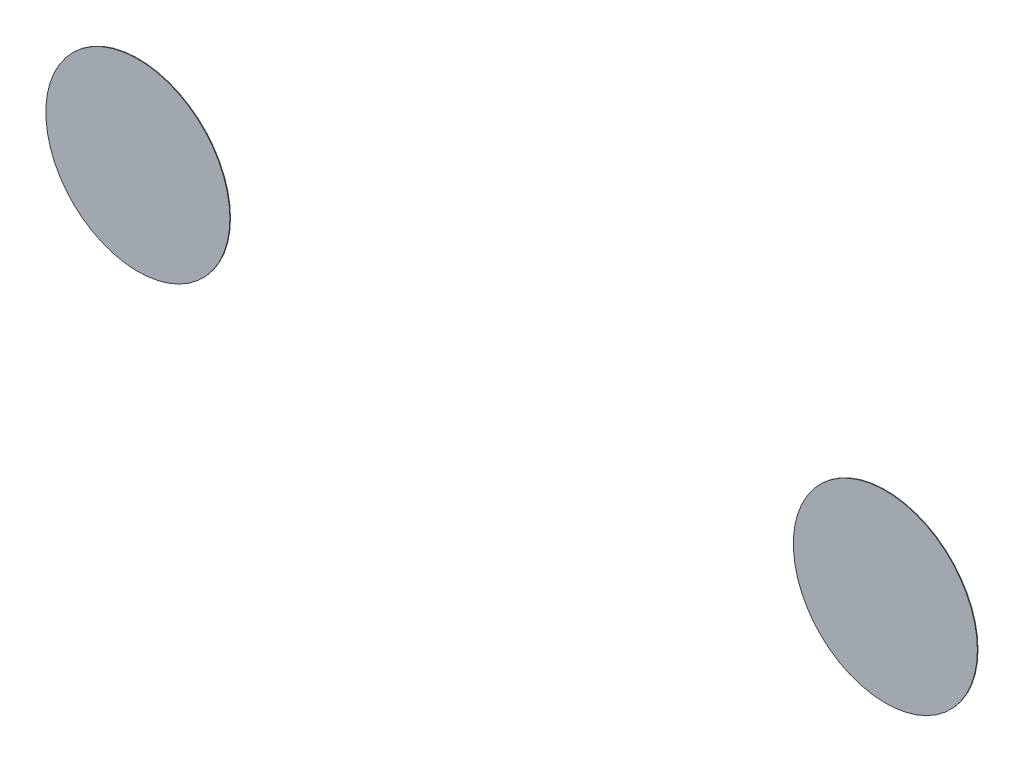
ISO-10303-21;
HEADER;
FILE_DESCRIPTION(('STEP AP214'),'2;1');
FILE_NAME('part.step','',(''),(''),'','','');
FILE_SCHEMA(('AUTOMOTIVE_DESIGN { 1 0 10303 214 1 1 1 1 }'));
ENDSEC;
DATA;
#1=APPLICATION_CONTEXT('core data for automotive mechanical design processes');
#2=APPLICATION_PROTOCOL_DEFINITION('international standard','automotive_design',2000,#1);
#3=PRODUCT_CONTEXT('',#1,'mechanical');
#4=PRODUCT('Part','Part','',(#3));
#5=PRODUCT_RELATED_PRODUCT_CATEGORY('part','',(#4));
#6=PRODUCT_DEFINITION_FORMATION('','',#4);
#7=PRODUCT_DEFINITION_CONTEXT('part definition',#1,'design');
#8=PRODUCT_DEFINITION('design','',#6,#7);
#9=PRODUCT_DEFINITION_SHAPE('','',#8);
#10=(LENGTH_UNIT() NAMED_UNIT(*) SI_UNIT(.MILLI.,.METRE.));
#11=(NAMED_UNIT(*) PLANE_ANGLE_UNIT() SI_UNIT($,.RADIAN.));
#12=(NAMED_UNIT(*) SI_UNIT($,.STERADIAN.) SOLID_ANGLE_UNIT());
#13=UNCERTAINTY_MEASURE_WITH_UNIT(LENGTH_MEASURE(1.E-05),#10,'distance_accuracy_value','');
#14=(GEOMETRIC_REPRESENTATION_CONTEXT(3) GLOBAL_UNCERTAINTY_ASSIGNED_CONTEXT((#13)) GLOBAL_UNIT_ASSIGNED_CONTEXT((#10,
#11,#12)) REPRESENTATION_CONTEXT('',''));
#15=CARTESIAN_POINT('',(0.,0.,0.));
#16=DIRECTION('',(0.,0.,1.));
#17=DIRECTION('',(1.,0.,0.));
#18=AXIS2_PLACEMENT_3D('',#15,#16,#17);
#19=CARTESIAN_POINT('',(-3.78618481556425,-7.17051145702336,0.001));
#20=DIRECTION('',(0.,0.,1.));
#21=DIRECTION('',(1.,0.,0.));
#22=AXIS2_PLACEMENT_3D('',#19,#20,#21);
#23=PLANE('',#22);
#24=CARTESIAN_POINT('',(-3.78618481556425,-7.17051145702336,0.001));
#25=DIRECTION('',(0.,0.,1.));
#26=DIRECTION('',(1.,0.,0.));
#27=AXIS2_PLACEMENT_3D('',#24,#25,#26);
#28=CIRCLE('',#27,0.319576228335678);
#29=CARTESIAN_POINT('',(-3.46660858722857,-7.17051145702336,0.001));
#30=VERTEX_POINT('',#29);
#31=EDGE_CURVE('P0_E22',#30,#30,#28,.F.);
#32=ORIENTED_EDGE('',*,*,#31,.F.);
#33=EDGE_LOOP('',(#32));
#34=FACE_BOUND('',#33,.T.);
#35=ADVANCED_FACE('P0_F15',(#34),#23,.T.);
#36=CARTESIAN_POINT('',(-3.78618481556425,-7.17051145702336,0.));
#37=DIRECTION('',(0.,0.,1.));
#38=DIRECTION('',(1.,0.,0.));
#39=AXIS2_PLACEMENT_3D('',#36,#37,#38);
#40=CYLINDRICAL_SURFACE('',#39,0.319576228335678);
#41=CARTESIAN_POINT('',(-3.78618481556425,-7.17051145702336,-0.001));
#42=DIRECTION('',(0.,0.,1.));
#43=DIRECTION('',(1.,0.,0.));
#44=AXIS2_PLACEMENT_3D('',#41,#42,#43);
#45=CIRCLE('',#44,0.319576228335678);
#46=CARTESIAN_POINT('',(-3.46660858722857,-7.17051145702336,-0.001));
#47=VERTEX_POINT('',#46);
#48=EDGE_CURVE('P0_E10',#47,#47,#45,.T.);
#49=ORIENTED_EDGE('',*,*,#48,.T.);
#50=EDGE_LOOP('',(#49));
#51=FACE_BOUND('',#50,.T.);
#52=ORIENTED_EDGE('',*,*,#31,.T.);
#53=EDGE_LOOP('',(#52));
#54=FACE_BOUND('',#53,.T.);
#55=ADVANCED_FACE('P0_F31',(#51,#54),#40,.T.);
#56=CARTESIAN_POINT('',(-3.78618481556425,-7.17051145702336,-0.001));
#57=DIRECTION('',(0.,0.,1.));
#58=DIRECTION('',(1.,0.,0.));
#59=AXIS2_PLACEMENT_3D('',#56,#57,#58);
#60=PLANE('',#59);
#61=ORIENTED_EDGE('',*,*,#48,.F.);
#62=EDGE_LOOP('',(#61));
#63=FACE_BOUND('',#62,.T.);
#64=ADVANCED_FACE('P0_F38',(#63),#60,.F.);
#65=CLOSED_SHELL('',(#35,#55,#64));
#66=MANIFOLD_SOLID_BREP('P0_B1',#65);
#67=CARTESIAN_POINT('',(-6.38152474236088,-7.17051145702336,0.001));
#68=DIRECTION('',(0.,0.,1.));
#69=DIRECTION('',(1.,0.,0.));
#70=AXIS2_PLACEMENT_3D('',#67,#68,#69);
#71=PLANE('',#70);
#72=CARTESIAN_POINT('',(-6.38152474236088,-7.17051145702336,0.001));
#73=DIRECTION('',(0.,0.,1.));
#74=DIRECTION('',(1.,0.,0.));
#75=AXIS2_PLACEMENT_3D('',#72,#73,#74);
#76=CIRCLE('',#75,0.319576228335678);
#77=CARTESIAN_POINT('',(-6.0619485140252,-7.17051145702336,0.001));
#78=VERTEX_POINT('',#77);
#79=EDGE_CURVE('P1_E22',#78,#78,#76,.F.);
#80=ORIENTED_EDGE('',*,*,#79,.F.);
#81=EDGE_LOOP('',(#80));
#82=FACE_BOUND('',#81,.T.);
#83=ADVANCED_FACE('P1_F15',(#82),#71,.T.);
#84=CARTESIAN_POINT('',(-6.38152474236088,-7.17051145702336,0.));
#85=DIRECTION('',(0.,0.,1.));
#86=DIRECTION('',(1.,0.,0.));
#87=AXIS2_PLACEMENT_3D('',#84,#85,#86);
#88=CYLINDRICAL_SURFACE('',#87,0.319576228335678);
#89=CARTESIAN_POINT('',(-6.38152474236088,-7.17051145702336,-0.001));
#90=DIRECTION('',(0.,0.,1.));
#91=DIRECTION('',(1.,0.,0.));
#92=AXIS2_PLACEMENT_3D('',#89,#90,#91);
#93=CIRCLE('',#92,0.319576228335678);
#94=CARTESIAN_POINT('',(-6.0619485140252,-7.17051145702336,-0.001));
#95=VERTEX_POINT('',#94);
#96=EDGE_CURVE('P1_E10',#95,#95,#93,.T.);
#97=ORIENTED_EDGE('',*,*,#96,.T.);
#98=EDGE_LOOP('',(#97));
#99=FACE_BOUND('',#98,.T.);
#100=ORIENTED_EDGE('',*,*,#79,.T.);
#101=EDGE_LOOP('',(#100));
#102=FACE_BOUND('',#101,.T.);
#103=ADVANCED_FACE('P1_F31',(#99,#102),#88,.T.);
#104=CARTESIAN_POINT('',(-6.38152474236088,-7.17051145702336,-0.001));
#105=DIRECTION('',(0.,0.,1.));
#106=DIRECTION('',(1.,0.,0.));
#107=AXIS2_PLACEMENT_3D('',#104,#105,#106);
#108=PLANE('',#107);
#109=ORIENTED_EDGE('',*,*,#96,.F.);
#110=EDGE_LOOP('',(#109));
#111=FACE_BOUND('',#110,.T.);
#112=ADVANCED_FACE('P1_F38',(#111),#108,.F.);
#113=CLOSED_SHELL('',(#83,#103,#112));
#114=MANIFOLD_SOLID_BREP('P1_B1',#113);
#115=ADVANCED_BREP_SHAPE_REPRESENTATION('',(#18,#66,#114),#14);
#116=SHAPE_DEFINITION_REPRESENTATION(#9,#115);
ENDSEC;
END-ISO-10303-21;
